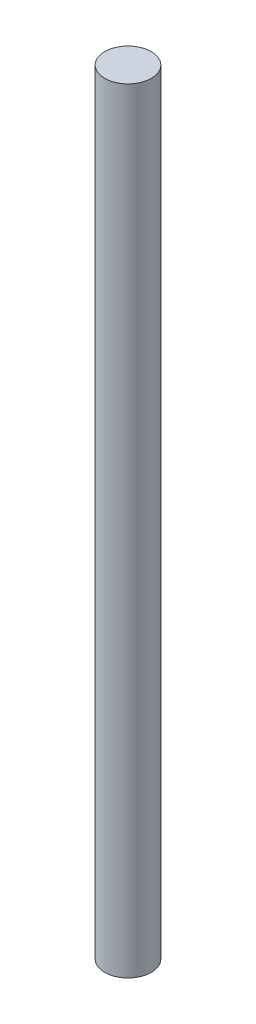
ISO-10303-21;
HEADER;
FILE_DESCRIPTION(('STEP AP214'),'2;1');
FILE_NAME('part.step','',(''),(''),'','','');
FILE_SCHEMA(('AUTOMOTIVE_DESIGN { 1 0 10303 214 1 1 1 1 }'));
ENDSEC;
DATA;
#1=APPLICATION_CONTEXT('core data for automotive mechanical design processes');
#2=APPLICATION_PROTOCOL_DEFINITION('international standard','automotive_design',2000,#1);
#3=PRODUCT_CONTEXT('',#1,'mechanical');
#4=PRODUCT('Part','Part','',(#3));
#5=PRODUCT_RELATED_PRODUCT_CATEGORY('part','',(#4));
#6=PRODUCT_DEFINITION_FORMATION('','',#4);
#7=PRODUCT_DEFINITION_CONTEXT('part definition',#1,'design');
#8=PRODUCT_DEFINITION('design','',#6,#7);
#9=PRODUCT_DEFINITION_SHAPE('','',#8);
#10=(LENGTH_UNIT() NAMED_UNIT(*) SI_UNIT(.MILLI.,.METRE.));
#11=(NAMED_UNIT(*) PLANE_ANGLE_UNIT() SI_UNIT($,.RADIAN.));
#12=(NAMED_UNIT(*) SI_UNIT($,.STERADIAN.) SOLID_ANGLE_UNIT());
#13=UNCERTAINTY_MEASURE_WITH_UNIT(LENGTH_MEASURE(1.E-05),#10,'distance_accuracy_value','');
#14=(GEOMETRIC_REPRESENTATION_CONTEXT(3) GLOBAL_UNCERTAINTY_ASSIGNED_CONTEXT((#13)) GLOBAL_UNIT_ASSIGNED_CONTEXT((#10,
#11,#12)) REPRESENTATION_CONTEXT('',''));
#15=CARTESIAN_POINT('',(0.,0.,0.));
#16=DIRECTION('',(0.,0.,1.));
#17=DIRECTION('',(1.,0.,0.));
#18=AXIS2_PLACEMENT_3D('',#15,#16,#17);
#19=CARTESIAN_POINT('',(0.,100.,0.));
#20=DIRECTION('',(0.,-1.,0.));
#21=DIRECTION('',(0.,0.,-1.));
#22=AXIS2_PLACEMENT_3D('',#19,#20,#21);
#23=CYLINDRICAL_SURFACE('',#22,3.);
#24=CARTESIAN_POINT('',(0.,100.,0.));
#25=DIRECTION('',(0.,1.,0.));
#26=DIRECTION('',(0.,0.,1.));
#27=AXIS2_PLACEMENT_3D('',#24,#25,#26);
#28=CIRCLE('',#27,3.);
#29=CARTESIAN_POINT('',(0.,100.,3.));
#30=VERTEX_POINT('',#29);
#31=EDGE_CURVE('E10',#30,#30,#28,.T.);
#32=ORIENTED_EDGE('',*,*,#31,.F.);
#33=EDGE_LOOP('',(#32));
#34=FACE_BOUND('',#33,.T.);
#35=CARTESIAN_POINT('',(0.,0.,0.));
#36=DIRECTION('',(0.,1.,0.));
#37=DIRECTION('',(0.,0.,1.));
#38=AXIS2_PLACEMENT_3D('',#35,#36,#37);
#39=CIRCLE('',#38,3.);
#40=CARTESIAN_POINT('',(0.,0.,3.));
#41=VERTEX_POINT('',#40);
#42=EDGE_CURVE('E33',#41,#41,#39,.T.);
#43=ORIENTED_EDGE('',*,*,#42,.T.);
#44=EDGE_LOOP('',(#43));
#45=FACE_BOUND('',#44,.T.);
#46=ADVANCED_FACE('F30',(#34,#45),#23,.T.);
#47=CARTESIAN_POINT('',(0.,100.,0.));
#48=DIRECTION('',(0.,1.,0.));
#49=DIRECTION('',(0.,0.,1.));
#50=AXIS2_PLACEMENT_3D('',#47,#48,#49);
#51=PLANE('',#50);
#52=ORIENTED_EDGE('',*,*,#31,.T.);
#53=EDGE_LOOP('',(#52));
#54=FACE_BOUND('',#53,.T.);
#55=ADVANCED_FACE('F59',(#54),#51,.T.);
#56=CARTESIAN_POINT('',(0.,0.,0.));
#57=DIRECTION('',(0.,1.,0.));
#58=DIRECTION('',(0.,0.,1.));
#59=AXIS2_PLACEMENT_3D('',#56,#57,#58);
#60=PLANE('',#59);
#61=CARTESIAN_POINT('',(0.,0.,0.));
#62=DIRECTION('',(0.,-1.,0.));
#63=DIRECTION('',(0.,0.,-1.));
#64=AXIS2_PLACEMENT_3D('',#61,#62,#63);
#65=CIRCLE('',#64,1.65);
#66=CARTESIAN_POINT('',(0.,0.,-1.65));
#67=VERTEX_POINT('',#66);
#68=EDGE_CURVE('E42',#67,#67,#65,.T.);
#69=ORIENTED_EDGE('',*,*,#68,.F.);
#70=EDGE_LOOP('',(#69));
#71=FACE_BOUND('',#70,.T.);
#72=ORIENTED_EDGE('',*,*,#42,.F.);
#73=EDGE_LOOP('',(#72));
#74=FACE_BOUND('',#73,.T.);
#75=ADVANCED_FACE('F53',(#71,#74),#60,.F.);
#76=CARTESIAN_POINT('',(0.,4.,0.));
#77=DIRECTION('',(0.,-1.,0.));
#78=DIRECTION('',(0.,0.,-1.));
#79=AXIS2_PLACEMENT_3D('',#76,#77,#78);
#80=CYLINDRICAL_SURFACE('',#79,1.65);
#81=CARTESIAN_POINT('',(0.,4.,0.));
#82=DIRECTION('',(0.,-1.,0.));
#83=DIRECTION('',(0.,0.,-1.));
#84=AXIS2_PLACEMENT_3D('',#81,#82,#83);
#85=CIRCLE('',#84,1.65);
#86=CARTESIAN_POINT('',(0.,4.,-1.65));
#87=VERTEX_POINT('',#86);
#88=EDGE_CURVE('E40',#87,#87,#85,.T.);
#89=ORIENTED_EDGE('',*,*,#88,.F.);
#90=EDGE_LOOP('',(#89));
#91=FACE_BOUND('',#90,.T.);
#92=ORIENTED_EDGE('',*,*,#68,.T.);
#93=EDGE_LOOP('',(#92));
#94=FACE_BOUND('',#93,.T.);
#95=ADVANCED_FACE('F50',(#91,#94),#80,.F.);
#96=CARTESIAN_POINT('',(0.,4.,0.));
#97=DIRECTION('',(0.,-1.,0.));
#98=DIRECTION('',(0.,0.,-1.));
#99=AXIS2_PLACEMENT_3D('',#96,#97,#98);
#100=PLANE('',#99);
#101=ORIENTED_EDGE('',*,*,#88,.T.);
#102=EDGE_LOOP('',(#101));
#103=FACE_BOUND('',#102,.T.);
#104=ADVANCED_FACE('F48',(#103),#100,.T.);
#105=CLOSED_SHELL('',(#46,#55,#75,#95,#104));
#106=MANIFOLD_SOLID_BREP('B2',#105);
#107=ADVANCED_BREP_SHAPE_REPRESENTATION('',(#18,#106),#14);
#108=SHAPE_DEFINITION_REPRESENTATION(#9,#107);
ENDSEC;
END-ISO-10303-21;
